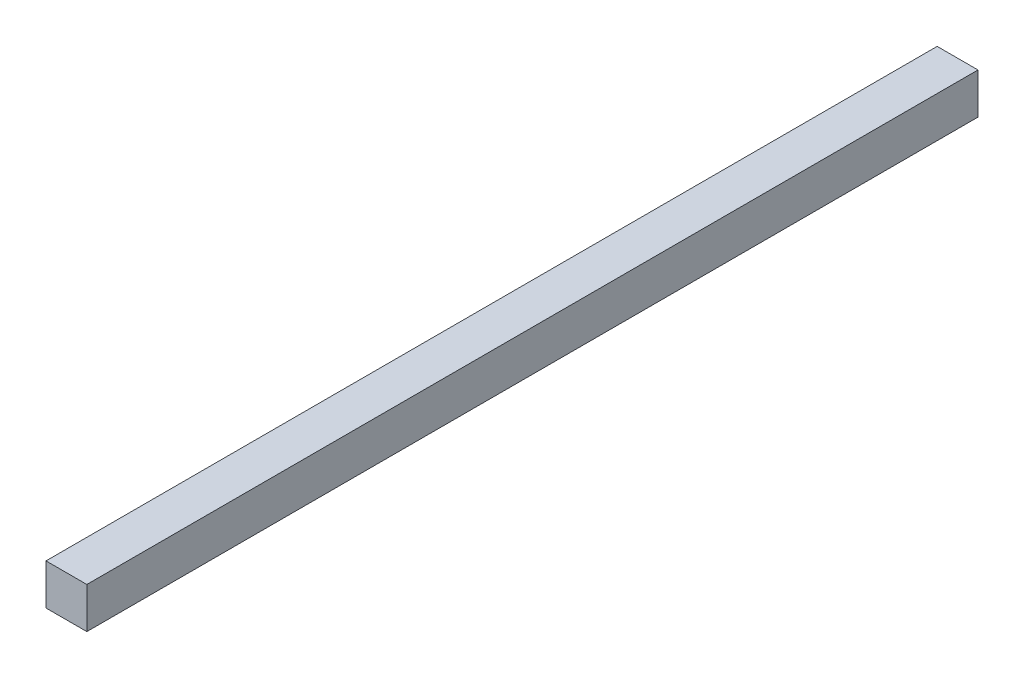
ISO-10303-21;
HEADER;
FILE_DESCRIPTION(('STEP AP214'),'2;1');
FILE_NAME('part.step','',(''),(''),'','','');
FILE_SCHEMA(('AUTOMOTIVE_DESIGN { 1 0 10303 214 1 1 1 1 }'));
ENDSEC;
DATA;
#1=APPLICATION_CONTEXT('core data for automotive mechanical design processes');
#2=APPLICATION_PROTOCOL_DEFINITION('international standard','automotive_design',2000,#1);
#3=PRODUCT_CONTEXT('',#1,'mechanical');
#4=PRODUCT('Part','Part','',(#3));
#5=PRODUCT_RELATED_PRODUCT_CATEGORY('part','',(#4));
#6=PRODUCT_DEFINITION_FORMATION('','',#4);
#7=PRODUCT_DEFINITION_CONTEXT('part definition',#1,'design');
#8=PRODUCT_DEFINITION('design','',#6,#7);
#9=PRODUCT_DEFINITION_SHAPE('','',#8);
#10=(LENGTH_UNIT() NAMED_UNIT(*) SI_UNIT(.MILLI.,.METRE.));
#11=(NAMED_UNIT(*) PLANE_ANGLE_UNIT() SI_UNIT($,.RADIAN.));
#12=(NAMED_UNIT(*) SI_UNIT($,.STERADIAN.) SOLID_ANGLE_UNIT());
#13=UNCERTAINTY_MEASURE_WITH_UNIT(LENGTH_MEASURE(1.E-05),#10,'distance_accuracy_value','');
#14=(GEOMETRIC_REPRESENTATION_CONTEXT(3) GLOBAL_UNCERTAINTY_ASSIGNED_CONTEXT((#13)) GLOBAL_UNIT_ASSIGNED_CONTEXT((#10,
#11,#12)) REPRESENTATION_CONTEXT('',''));
#15=CARTESIAN_POINT('',(0.,0.,0.));
#16=DIRECTION('',(0.,0.,1.));
#17=DIRECTION('',(1.,0.,0.));
#18=AXIS2_PLACEMENT_3D('',#15,#16,#17);
#19=CARTESIAN_POINT('',(-17.4625,17.4625,762.));
#20=DIRECTION('',(1.,0.,0.));
#21=DIRECTION('',(0.,0.,-1.));
#22=AXIS2_PLACEMENT_3D('',#19,#20,#21);
#23=PLANE('',#22);
#24=DIRECTION('',(0.,-1.,0.));
#25=VECTOR('',#24,1.);
#26=CARTESIAN_POINT('',(-17.4625,17.4625,0.));
#27=LINE('',#26,#25);
#28=CARTESIAN_POINT('',(-17.4625,17.4625,0.));
#29=VERTEX_POINT('',#28);
#30=CARTESIAN_POINT('',(-17.4625,-17.4625,0.));
#31=VERTEX_POINT('',#30);
#32=EDGE_CURVE('E100',#29,#31,#27,.T.);
#33=ORIENTED_EDGE('',*,*,#32,.T.);
#34=DIRECTION('',(0.,0.,-1.));
#35=VECTOR('',#34,1.);
#36=CARTESIAN_POINT('',(-17.4625,-17.4625,762.));
#37=LINE('',#36,#35);
#38=CARTESIAN_POINT('',(-17.4625,-17.4625,762.));
#39=VERTEX_POINT('',#38);
#40=EDGE_CURVE('E11',#39,#31,#37,.T.);
#41=ORIENTED_EDGE('',*,*,#40,.F.);
#42=DIRECTION('',(0.,-1.,0.));
#43=VECTOR('',#42,1.);
#44=CARTESIAN_POINT('',(-17.4625,17.4625,762.));
#45=LINE('',#44,#43);
#46=CARTESIAN_POINT('',(-17.4625,17.4625,762.));
#47=VERTEX_POINT('',#46);
#48=EDGE_CURVE('E88',#47,#39,#45,.T.);
#49=ORIENTED_EDGE('',*,*,#48,.F.);
#50=DIRECTION('',(0.,0.,-1.));
#51=VECTOR('',#50,1.);
#52=CARTESIAN_POINT('',(-17.4625,17.4625,762.));
#53=LINE('',#52,#51);
#54=EDGE_CURVE('E96',#47,#29,#53,.T.);
#55=ORIENTED_EDGE('',*,*,#54,.T.);
#56=EDGE_LOOP('',(#33,#41,#49,#55));
#57=FACE_BOUND('',#56,.T.);
#58=ADVANCED_FACE('F37',(#57),#23,.F.);
#59=CARTESIAN_POINT('',(17.4625,-17.4625,762.));
#60=DIRECTION('',(0.,1.,0.));
#61=DIRECTION('',(0.,0.,1.));
#62=AXIS2_PLACEMENT_3D('',#59,#60,#61);
#63=PLANE('',#62);
#64=DIRECTION('',(1.,0.,0.));
#65=VECTOR('',#64,1.);
#66=CARTESIAN_POINT('',(17.4625,-17.4625,0.));
#67=LINE('',#66,#65);
#68=CARTESIAN_POINT('',(17.4625,-17.4625,0.));
#69=VERTEX_POINT('',#68);
#70=EDGE_CURVE('E92',#31,#69,#67,.T.);
#71=ORIENTED_EDGE('',*,*,#70,.T.);
#72=DIRECTION('',(0.,0.,-1.));
#73=VECTOR('',#72,1.);
#74=CARTESIAN_POINT('',(17.4625,-17.4625,762.));
#75=LINE('',#74,#73);
#76=CARTESIAN_POINT('',(17.4625,-17.4625,762.));
#77=VERTEX_POINT('',#76);
#78=EDGE_CURVE('E45',#77,#69,#75,.T.);
#79=ORIENTED_EDGE('',*,*,#78,.F.);
#80=DIRECTION('',(1.,0.,0.));
#81=VECTOR('',#80,1.);
#82=CARTESIAN_POINT('',(17.4625,-17.4625,762.));
#83=LINE('',#82,#81);
#84=EDGE_CURVE('E83',#39,#77,#83,.T.);
#85=ORIENTED_EDGE('',*,*,#84,.F.);
#86=ORIENTED_EDGE('',*,*,#40,.T.);
#87=EDGE_LOOP('',(#71,#79,#85,#86));
#88=FACE_BOUND('',#87,.T.);
#89=ADVANCED_FACE('F91',(#88),#63,.F.);
#90=CARTESIAN_POINT('',(17.4625,17.4625,762.));
#91=DIRECTION('',(-1.,0.,0.));
#92=DIRECTION('',(0.,0.,1.));
#93=AXIS2_PLACEMENT_3D('',#90,#91,#92);
#94=PLANE('',#93);
#95=DIRECTION('',(0.,1.,0.));
#96=VECTOR('',#95,1.);
#97=CARTESIAN_POINT('',(17.4625,17.4625,0.));
#98=LINE('',#97,#96);
#99=CARTESIAN_POINT('',(17.4625,17.4625,0.));
#100=VERTEX_POINT('',#99);
#101=EDGE_CURVE('E70',#69,#100,#98,.T.);
#102=ORIENTED_EDGE('',*,*,#101,.T.);
#103=DIRECTION('',(0.,0.,-1.));
#104=VECTOR('',#103,1.);
#105=CARTESIAN_POINT('',(17.4625,17.4625,762.));
#106=LINE('',#105,#104);
#107=CARTESIAN_POINT('',(17.4625,17.4625,762.));
#108=VERTEX_POINT('',#107);
#109=EDGE_CURVE('E93',#108,#100,#106,.T.);
#110=ORIENTED_EDGE('',*,*,#109,.F.);
#111=DIRECTION('',(0.,1.,0.));
#112=VECTOR('',#111,1.);
#113=CARTESIAN_POINT('',(17.4625,17.4625,762.));
#114=LINE('',#113,#112);
#115=EDGE_CURVE('E86',#77,#108,#114,.T.);
#116=ORIENTED_EDGE('',*,*,#115,.F.);
#117=ORIENTED_EDGE('',*,*,#78,.T.);
#118=EDGE_LOOP('',(#102,#110,#116,#117));
#119=FACE_BOUND('',#118,.T.);
#120=ADVANCED_FACE('F94',(#119),#94,.F.);
#121=CARTESIAN_POINT('',(17.4625,17.4625,762.));
#122=DIRECTION('',(0.,-1.,0.));
#123=DIRECTION('',(0.,0.,-1.));
#124=AXIS2_PLACEMENT_3D('',#121,#122,#123);
#125=PLANE('',#124);
#126=DIRECTION('',(-1.,0.,0.));
#127=VECTOR('',#126,1.);
#128=CARTESIAN_POINT('',(17.4625,17.4625,0.));
#129=LINE('',#128,#127);
#130=EDGE_CURVE('E76',#100,#29,#129,.T.);
#131=ORIENTED_EDGE('',*,*,#130,.T.);
#132=ORIENTED_EDGE('',*,*,#54,.F.);
#133=DIRECTION('',(-1.,0.,0.));
#134=VECTOR('',#133,1.);
#135=CARTESIAN_POINT('',(17.4625,17.4625,762.));
#136=LINE('',#135,#134);
#137=EDGE_CURVE('E53',#108,#47,#136,.T.);
#138=ORIENTED_EDGE('',*,*,#137,.F.);
#139=ORIENTED_EDGE('',*,*,#109,.T.);
#140=EDGE_LOOP('',(#131,#132,#138,#139));
#141=FACE_BOUND('',#140,.T.);
#142=ADVANCED_FACE('F107',(#141),#125,.F.);
#143=CARTESIAN_POINT('',(0.,0.,762.));
#144=DIRECTION('',(0.,0.,-1.));
#145=DIRECTION('',(-1.,0.,0.));
#146=AXIS2_PLACEMENT_3D('',#143,#144,#145);
#147=PLANE('',#146);
#148=ORIENTED_EDGE('',*,*,#48,.T.);
#149=ORIENTED_EDGE('',*,*,#84,.T.);
#150=ORIENTED_EDGE('',*,*,#115,.T.);
#151=ORIENTED_EDGE('',*,*,#137,.T.);
#152=EDGE_LOOP('',(#148,#149,#150,#151));
#153=FACE_BOUND('',#152,.T.);
#154=ADVANCED_FACE('F84',(#153),#147,.F.);
#155=CARTESIAN_POINT('',(0.,0.,0.));
#156=DIRECTION('',(0.,0.,-1.));
#157=DIRECTION('',(-1.,0.,0.));
#158=AXIS2_PLACEMENT_3D('',#155,#156,#157);
#159=PLANE('',#158);
#160=ORIENTED_EDGE('',*,*,#32,.F.);
#161=ORIENTED_EDGE('',*,*,#130,.F.);
#162=ORIENTED_EDGE('',*,*,#101,.F.);
#163=ORIENTED_EDGE('',*,*,#70,.F.);
#164=EDGE_LOOP('',(#160,#161,#162,#163));
#165=FACE_BOUND('',#164,.T.);
#166=ADVANCED_FACE('F110',(#165),#159,.T.);
#167=CLOSED_SHELL('',(#58,#89,#120,#142,#154,#166));
#168=MANIFOLD_SOLID_BREP('B2',#167);
#169=ADVANCED_BREP_SHAPE_REPRESENTATION('',(#18,#168),#14);
#170=SHAPE_DEFINITION_REPRESENTATION(#9,#169);
ENDSEC;
END-ISO-10303-21;
